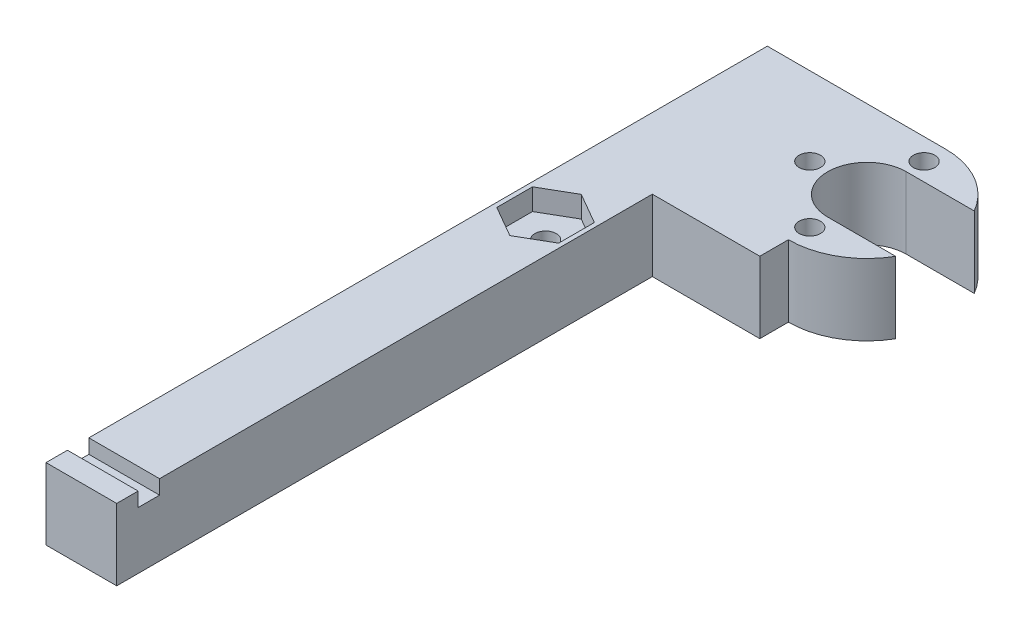
ISO-10303-21;
HEADER;
FILE_DESCRIPTION(('STEP AP214'),'2;1');
FILE_NAME('part.step','',(''),(''),'','','');
FILE_SCHEMA(('AUTOMOTIVE_DESIGN { 1 0 10303 214 1 1 1 1 }'));
ENDSEC;
DATA;
#1=APPLICATION_CONTEXT('core data for automotive mechanical design processes');
#2=APPLICATION_PROTOCOL_DEFINITION('international standard','automotive_design',2000,#1);
#3=PRODUCT_CONTEXT('',#1,'mechanical');
#4=PRODUCT('Part','Part','',(#3));
#5=PRODUCT_RELATED_PRODUCT_CATEGORY('part','',(#4));
#6=PRODUCT_DEFINITION_FORMATION('','',#4);
#7=PRODUCT_DEFINITION_CONTEXT('part definition',#1,'design');
#8=PRODUCT_DEFINITION('design','',#6,#7);
#9=PRODUCT_DEFINITION_SHAPE('','',#8);
#10=(LENGTH_UNIT() NAMED_UNIT(*) SI_UNIT(.MILLI.,.METRE.));
#11=(NAMED_UNIT(*) PLANE_ANGLE_UNIT() SI_UNIT($,.RADIAN.));
#12=(NAMED_UNIT(*) SI_UNIT($,.STERADIAN.) SOLID_ANGLE_UNIT());
#13=UNCERTAINTY_MEASURE_WITH_UNIT(LENGTH_MEASURE(1.E-05),#10,'distance_accuracy_value','');
#14=(GEOMETRIC_REPRESENTATION_CONTEXT(3) GLOBAL_UNCERTAINTY_ASSIGNED_CONTEXT((#13)) GLOBAL_UNIT_ASSIGNED_CONTEXT((#10,
#11,#12)) REPRESENTATION_CONTEXT('',''));
#15=CARTESIAN_POINT('',(0.,0.,0.));
#16=DIRECTION('',(0.,0.,1.));
#17=DIRECTION('',(1.,0.,0.));
#18=AXIS2_PLACEMENT_3D('',#15,#16,#17);
#19=CARTESIAN_POINT('',(4.95,0.,10.));
#20=DIRECTION('',(0.,1.,0.));
#21=DIRECTION('',(0.,0.,1.));
#22=AXIS2_PLACEMENT_3D('',#19,#20,#21);
#23=CYLINDRICAL_SURFACE('',#22,1.5);
#24=CARTESIAN_POINT('',(4.95,0.,10.));
#25=DIRECTION('',(0.,1.,0.));
#26=DIRECTION('',(0.,0.,1.));
#27=AXIS2_PLACEMENT_3D('',#24,#25,#26);
#28=CIRCLE('',#27,1.5);
#29=CARTESIAN_POINT('',(4.95,0.,11.5));
#30=VERTEX_POINT('',#29);
#31=EDGE_CURVE('E233',#30,#30,#28,.T.);
#32=ORIENTED_EDGE('',*,*,#31,.F.);
#33=EDGE_LOOP('',(#32));
#34=FACE_BOUND('',#33,.T.);
#35=CARTESIAN_POINT('',(4.95,7.,10.));
#36=DIRECTION('',(0.,1.,0.));
#37=DIRECTION('',(0.,0.,1.));
#38=AXIS2_PLACEMENT_3D('',#35,#36,#37);
#39=CIRCLE('',#38,1.5);
#40=CARTESIAN_POINT('',(4.95,7.,11.5));
#41=VERTEX_POINT('',#40);
#42=EDGE_CURVE('E38',#41,#41,#39,.F.);
#43=ORIENTED_EDGE('',*,*,#42,.F.);
#44=EDGE_LOOP('',(#43));
#45=FACE_BOUND('',#44,.T.);
#46=ADVANCED_FACE('F34',(#34,#45),#23,.F.);
#47=CARTESIAN_POINT('',(24.95,10.,-15.));
#48=DIRECTION('',(0.,-1.,0.));
#49=DIRECTION('',(0.,0.,-1.));
#50=AXIS2_PLACEMENT_3D('',#47,#48,#49);
#51=CYLINDRICAL_SURFACE('',#50,11.);
#52=CARTESIAN_POINT('',(24.95,10.,-15.));
#53=DIRECTION('',(0.,1.,0.));
#54=DIRECTION('',(0.,0.,1.));
#55=AXIS2_PLACEMENT_3D('',#52,#53,#54);
#56=CIRCLE('',#55,11.);
#57=CARTESIAN_POINT('',(34.4762794416288,10.,-20.5));
#58=VERTEX_POINT('',#57);
#59=CARTESIAN_POINT('',(24.95,10.,-26.));
#60=VERTEX_POINT('',#59);
#61=EDGE_CURVE('E318',#58,#60,#56,.T.);
#62=ORIENTED_EDGE('',*,*,#61,.F.);
#63=DIRECTION('',(0.,-1.,0.));
#64=VECTOR('',#63,1.);
#65=CARTESIAN_POINT('',(34.4762794416288,10.,-20.5));
#66=LINE('',#65,#64);
#67=CARTESIAN_POINT('',(34.4762794416288,0.,-20.5));
#68=VERTEX_POINT('',#67);
#69=EDGE_CURVE('E252',#58,#68,#66,.T.);
#70=ORIENTED_EDGE('',*,*,#69,.T.);
#71=CARTESIAN_POINT('',(24.95,0.,-15.));
#72=DIRECTION('',(0.,1.,0.));
#73=DIRECTION('',(0.,0.,1.));
#74=AXIS2_PLACEMENT_3D('',#71,#72,#73);
#75=CIRCLE('',#74,11.);
#76=CARTESIAN_POINT('',(24.95,0.,-26.));
#77=VERTEX_POINT('',#76);
#78=EDGE_CURVE('E334',#68,#77,#75,.T.);
#79=ORIENTED_EDGE('',*,*,#78,.T.);
#80=DIRECTION('',(0.,-1.,0.));
#81=VECTOR('',#80,1.);
#82=CARTESIAN_POINT('',(24.95,10.,-26.));
#83=LINE('',#82,#81);
#84=EDGE_CURVE('E343',#60,#77,#83,.T.);
#85=ORIENTED_EDGE('',*,*,#84,.F.);
#86=EDGE_LOOP('',(#62,#70,#79,#85));
#87=FACE_BOUND('',#86,.T.);
#88=ADVANCED_FACE('F416',(#87),#51,.T.);
#89=CARTESIAN_POINT('',(24.95,10.,-15.));
#90=DIRECTION('',(0.,1.,0.));
#91=DIRECTION('',(0.,0.,1.));
#92=AXIS2_PLACEMENT_3D('',#89,#90,#91);
#93=PLANE('',#92);
#94=DIRECTION('',(-0.866025403784439,0.,-0.5));
#95=VECTOR('',#94,1.);
#96=CARTESIAN_POINT('',(9.2801270189222,10.,7.5));
#97=LINE('',#96,#95);
#98=CARTESIAN_POINT('',(9.2801270189222,10.,7.5));
#99=VERTEX_POINT('',#98);
#100=CARTESIAN_POINT('',(4.95000000000001,10.,5.));
#101=VERTEX_POINT('',#100);
#102=EDGE_CURVE('E50',#99,#101,#97,.T.);
#103=ORIENTED_EDGE('',*,*,#102,.F.);
#104=DIRECTION('',(0.,0.,-1.));
#105=VECTOR('',#104,1.);
#106=CARTESIAN_POINT('',(9.2801270189222,10.,12.5));
#107=LINE('',#106,#105);
#108=CARTESIAN_POINT('',(9.2801270189222,10.,12.5));
#109=VERTEX_POINT('',#108);
#110=EDGE_CURVE('E200',#109,#99,#107,.T.);
#111=ORIENTED_EDGE('',*,*,#110,.F.);
#112=DIRECTION('',(0.866025403784439,0.,-0.5));
#113=VECTOR('',#112,1.);
#114=CARTESIAN_POINT('',(4.95000000000001,10.,15.));
#115=LINE('',#114,#113);
#116=CARTESIAN_POINT('',(4.95000000000001,10.,15.));
#117=VERTEX_POINT('',#116);
#118=EDGE_CURVE('E203',#117,#109,#115,.T.);
#119=ORIENTED_EDGE('',*,*,#118,.F.);
#120=DIRECTION('',(0.866025403784439,0.,0.5));
#121=VECTOR('',#120,1.);
#122=CARTESIAN_POINT('',(0.619872981077811,10.,12.5));
#123=LINE('',#122,#121);
#124=CARTESIAN_POINT('',(0.619872981077811,10.,12.5));
#125=VERTEX_POINT('',#124);
#126=EDGE_CURVE('E219',#125,#117,#123,.T.);
#127=ORIENTED_EDGE('',*,*,#126,.F.);
#128=DIRECTION('',(0.,0.,1.));
#129=VECTOR('',#128,1.);
#130=CARTESIAN_POINT('',(0.61987298107781,10.,7.5));
#131=LINE('',#130,#129);
#132=CARTESIAN_POINT('',(0.61987298107781,10.,7.5));
#133=VERTEX_POINT('',#132);
#134=EDGE_CURVE('E216',#133,#125,#131,.T.);
#135=ORIENTED_EDGE('',*,*,#134,.F.);
#136=DIRECTION('',(-0.866025403784439,0.,0.5));
#137=VECTOR('',#136,1.);
#138=CARTESIAN_POINT('',(4.95,10.,5.));
#139=LINE('',#138,#137);
#140=EDGE_CURVE('E214',#101,#133,#139,.T.);
#141=ORIENTED_EDGE('',*,*,#140,.F.);
#142=EDGE_LOOP('',(#103,#111,#119,#127,#135,#141));
#143=FACE_BOUND('',#142,.T.);
#144=DIRECTION('',(-1.,0.,0.));
#145=VECTOR('',#144,1.);
#146=CARTESIAN_POINT('',(24.95,10.,-20.5));
#147=LINE('',#146,#145);
#148=CARTESIAN_POINT('',(24.95,10.,-20.5));
#149=VERTEX_POINT('',#148);
#150=EDGE_CURVE('E239',#58,#149,#147,.T.);
#151=ORIENTED_EDGE('',*,*,#150,.F.);
#152=ORIENTED_EDGE('',*,*,#61,.T.);
#153=DIRECTION('',(-1.,0.,0.));
#154=VECTOR('',#153,1.);
#155=CARTESIAN_POINT('',(0.,10.,-26.));
#156=LINE('',#155,#154);
#157=CARTESIAN_POINT('',(0.,10.,-26.));
#158=VERTEX_POINT('',#157);
#159=EDGE_CURVE('E322',#60,#158,#156,.T.);
#160=ORIENTED_EDGE('',*,*,#159,.T.);
#161=DIRECTION('',(0.,0.,1.));
#162=VECTOR('',#161,1.);
#163=CARTESIAN_POINT('',(0.,10.,0.));
#164=LINE('',#163,#162);
#165=CARTESIAN_POINT('',(0.,10.,69.));
#166=VERTEX_POINT('',#165);
#167=EDGE_CURVE('E304',#158,#166,#164,.T.);
#168=ORIENTED_EDGE('',*,*,#167,.T.);
#169=DIRECTION('',(-1.,0.,0.));
#170=VECTOR('',#169,1.);
#171=CARTESIAN_POINT('',(0.,10.,69.));
#172=LINE('',#171,#170);
#173=CARTESIAN_POINT('',(9.90000000000001,10.,69.));
#174=VERTEX_POINT('',#173);
#175=EDGE_CURVE('E260',#174,#166,#172,.T.);
#176=ORIENTED_EDGE('',*,*,#175,.F.);
#177=DIRECTION('',(0.,0.,-1.));
#178=VECTOR('',#177,1.);
#179=CARTESIAN_POINT('',(9.90000000000001,10.,75.));
#180=LINE('',#179,#178);
#181=CARTESIAN_POINT('',(9.90000000000001,10.,0.));
#182=VERTEX_POINT('',#181);
#183=EDGE_CURVE('E310',#174,#182,#180,.T.);
#184=ORIENTED_EDGE('',*,*,#183,.T.);
#185=DIRECTION('',(1.,0.,0.));
#186=VECTOR('',#185,1.);
#187=CARTESIAN_POINT('',(9.90000000000001,10.,0.));
#188=LINE('',#187,#186);
#189=CARTESIAN_POINT('',(24.95,10.,0.));
#190=VERTEX_POINT('',#189);
#191=EDGE_CURVE('E314',#182,#190,#188,.T.);
#192=ORIENTED_EDGE('',*,*,#191,.T.);
#193=DIRECTION('',(0.,0.,-1.));
#194=VECTOR('',#193,1.);
#195=CARTESIAN_POINT('',(24.95,10.,0.));
#196=LINE('',#195,#194);
#197=CARTESIAN_POINT('',(24.95,10.,-4.));
#198=VERTEX_POINT('',#197);
#199=EDGE_CURVE('E316',#190,#198,#196,.T.);
#200=ORIENTED_EDGE('',*,*,#199,.T.);
#201=CARTESIAN_POINT('',(34.4762794416288,10.,-9.5));
#202=VERTEX_POINT('',#201);
#203=EDGE_CURVE('E319',#198,#202,#56,.T.);
#204=ORIENTED_EDGE('',*,*,#203,.T.);
#205=DIRECTION('',(1.,0.,0.));
#206=VECTOR('',#205,1.);
#207=CARTESIAN_POINT('',(24.95,10.,-9.5));
#208=LINE('',#207,#206);
#209=CARTESIAN_POINT('',(24.95,10.,-9.5));
#210=VERTEX_POINT('',#209);
#211=EDGE_CURVE('E236',#210,#202,#208,.T.);
#212=ORIENTED_EDGE('',*,*,#211,.F.);
#213=CARTESIAN_POINT('',(24.95,10.,-15.));
#214=DIRECTION('',(0.,1.,0.));
#215=DIRECTION('',(0.,0.,1.));
#216=AXIS2_PLACEMENT_3D('',#213,#214,#215);
#217=CIRCLE('',#216,5.5);
#218=EDGE_CURVE('E298',#149,#210,#217,.T.);
#219=ORIENTED_EDGE('',*,*,#218,.F.);
#220=EDGE_LOOP('',(#151,#152,#160,#168,#176,#184,#192,#200,#204,#212,#219));
#221=FACE_BOUND('',#220,.T.);
#222=CARTESIAN_POINT('',(24.95,10.,-7.));
#223=DIRECTION('',(0.,1.,0.));
#224=DIRECTION('',(0.,0.,1.));
#225=AXIS2_PLACEMENT_3D('',#222,#223,#224);
#226=CIRCLE('',#225,1.5);
#227=CARTESIAN_POINT('',(24.95,10.,-5.5));
#228=VERTEX_POINT('',#227);
#229=EDGE_CURVE('E286',#228,#228,#226,.T.);
#230=ORIENTED_EDGE('',*,*,#229,.F.);
#231=EDGE_LOOP('',(#230));
#232=FACE_BOUND('',#231,.T.);
#233=CARTESIAN_POINT('',(24.95,10.,-23.));
#234=DIRECTION('',(0.,1.,0.));
#235=DIRECTION('',(0.,0.,1.));
#236=AXIS2_PLACEMENT_3D('',#233,#234,#235);
#237=CIRCLE('',#236,1.5);
#238=CARTESIAN_POINT('',(24.95,10.,-21.5));
#239=VERTEX_POINT('',#238);
#240=EDGE_CURVE('E292',#239,#239,#237,.T.);
#241=ORIENTED_EDGE('',*,*,#240,.F.);
#242=EDGE_LOOP('',(#241));
#243=FACE_BOUND('',#242,.T.);
#244=CARTESIAN_POINT('',(16.95,10.,-15.));
#245=DIRECTION('',(0.,1.,0.));
#246=DIRECTION('',(0.,0.,1.));
#247=AXIS2_PLACEMENT_3D('',#244,#245,#246);
#248=CIRCLE('',#247,1.5);
#249=CARTESIAN_POINT('',(16.95,10.,-13.5));
#250=VERTEX_POINT('',#249);
#251=EDGE_CURVE('E280',#250,#250,#248,.T.);
#252=ORIENTED_EDGE('',*,*,#251,.F.);
#253=EDGE_LOOP('',(#252));
#254=FACE_BOUND('',#253,.T.);
#255=ADVANCED_FACE('F384',(#143,#221,#232,#243,#254),#93,.T.);
#256=DIRECTION('',(1.,0.,0.));
#257=VECTOR('',#256,1.);
#258=CARTESIAN_POINT('',(0.,10.,72.));
#259=LINE('',#258,#257);
#260=CARTESIAN_POINT('',(0.,10.,72.));
#261=VERTEX_POINT('',#260);
#262=CARTESIAN_POINT('',(9.90000000000001,10.,72.));
#263=VERTEX_POINT('',#262);
#264=EDGE_CURVE('E255',#261,#263,#259,.T.);
#265=ORIENTED_EDGE('',*,*,#264,.F.);
#266=CARTESIAN_POINT('',(0.,10.,75.));
#267=VERTEX_POINT('',#266);
#268=EDGE_CURVE('E308',#261,#267,#164,.T.);
#269=ORIENTED_EDGE('',*,*,#268,.T.);
#270=DIRECTION('',(1.,0.,0.));
#271=VECTOR('',#270,1.);
#272=CARTESIAN_POINT('',(0.,10.,75.));
#273=LINE('',#272,#271);
#274=CARTESIAN_POINT('',(9.90000000000001,10.,75.));
#275=VERTEX_POINT('',#274);
#276=EDGE_CURVE('E307',#267,#275,#273,.T.);
#277=ORIENTED_EDGE('',*,*,#276,.T.);
#278=EDGE_CURVE('E311',#275,#263,#180,.T.);
#279=ORIENTED_EDGE('',*,*,#278,.T.);
#280=EDGE_LOOP('',(#265,#269,#277,#279));
#281=FACE_BOUND('',#280,.T.);
#282=ADVANCED_FACE('F406',(#281),#93,.T.);
#283=CARTESIAN_POINT('',(24.95,0.,-15.));
#284=DIRECTION('',(0.,1.,0.));
#285=DIRECTION('',(0.,0.,1.));
#286=AXIS2_PLACEMENT_3D('',#283,#284,#285);
#287=PLANE('',#286);
#288=ORIENTED_EDGE('',*,*,#31,.T.);
#289=EDGE_LOOP('',(#288));
#290=FACE_BOUND('',#289,.T.);
#291=ORIENTED_EDGE('',*,*,#78,.F.);
#292=DIRECTION('',(-1.,0.,0.));
#293=VECTOR('',#292,1.);
#294=CARTESIAN_POINT('',(24.95,0.,-20.5));
#295=LINE('',#294,#293);
#296=CARTESIAN_POINT('',(24.95,0.,-20.5));
#297=VERTEX_POINT('',#296);
#298=EDGE_CURVE('E238',#68,#297,#295,.T.);
#299=ORIENTED_EDGE('',*,*,#298,.T.);
#300=CARTESIAN_POINT('',(24.95,0.,-15.));
#301=DIRECTION('',(0.,1.,0.));
#302=DIRECTION('',(0.,0.,1.));
#303=AXIS2_PLACEMENT_3D('',#300,#301,#302);
#304=CIRCLE('',#303,5.5);
#305=CARTESIAN_POINT('',(24.95,0.,-9.5));
#306=VERTEX_POINT('',#305);
#307=EDGE_CURVE('E295',#297,#306,#304,.T.);
#308=ORIENTED_EDGE('',*,*,#307,.T.);
#309=DIRECTION('',(1.,0.,0.));
#310=VECTOR('',#309,1.);
#311=CARTESIAN_POINT('',(24.95,0.,-9.5));
#312=LINE('',#311,#310);
#313=CARTESIAN_POINT('',(34.4762794416288,0.,-9.5));
#314=VERTEX_POINT('',#313);
#315=EDGE_CURVE('E58',#306,#314,#312,.T.);
#316=ORIENTED_EDGE('',*,*,#315,.T.);
#317=CARTESIAN_POINT('',(24.95,0.,-4.));
#318=VERTEX_POINT('',#317);
#319=EDGE_CURVE('E335',#318,#314,#75,.T.);
#320=ORIENTED_EDGE('',*,*,#319,.F.);
#321=DIRECTION('',(0.,0.,-1.));
#322=VECTOR('',#321,1.);
#323=CARTESIAN_POINT('',(24.95,0.,0.));
#324=LINE('',#323,#322);
#325=CARTESIAN_POINT('',(24.95,0.,0.));
#326=VERTEX_POINT('',#325);
#327=EDGE_CURVE('E332',#326,#318,#324,.T.);
#328=ORIENTED_EDGE('',*,*,#327,.F.);
#329=DIRECTION('',(1.,0.,0.));
#330=VECTOR('',#329,1.);
#331=CARTESIAN_POINT('',(9.90000000000001,0.,0.));
#332=LINE('',#331,#330);
#333=CARTESIAN_POINT('',(9.90000000000001,0.,0.));
#334=VERTEX_POINT('',#333);
#335=EDGE_CURVE('E330',#334,#326,#332,.T.);
#336=ORIENTED_EDGE('',*,*,#335,.F.);
#337=DIRECTION('',(0.,0.,-1.));
#338=VECTOR('',#337,1.);
#339=CARTESIAN_POINT('',(9.90000000000001,0.,75.));
#340=LINE('',#339,#338);
#341=CARTESIAN_POINT('',(9.90000000000001,0.,75.));
#342=VERTEX_POINT('',#341);
#343=EDGE_CURVE('E328',#342,#334,#340,.T.);
#344=ORIENTED_EDGE('',*,*,#343,.F.);
#345=DIRECTION('',(1.,0.,0.));
#346=VECTOR('',#345,1.);
#347=CARTESIAN_POINT('',(0.,0.,75.));
#348=LINE('',#347,#346);
#349=CARTESIAN_POINT('',(0.,0.,75.));
#350=VERTEX_POINT('',#349);
#351=EDGE_CURVE('E326',#350,#342,#348,.T.);
#352=ORIENTED_EDGE('',*,*,#351,.F.);
#353=DIRECTION('',(0.,0.,1.));
#354=VECTOR('',#353,1.);
#355=CARTESIAN_POINT('',(0.,0.,0.));
#356=LINE('',#355,#354);
#357=CARTESIAN_POINT('',(0.,0.,-26.));
#358=VERTEX_POINT('',#357);
#359=EDGE_CURVE('E301',#358,#350,#356,.T.);
#360=ORIENTED_EDGE('',*,*,#359,.F.);
#361=DIRECTION('',(-1.,0.,0.));
#362=VECTOR('',#361,1.);
#363=CARTESIAN_POINT('',(0.,0.,-26.));
#364=LINE('',#363,#362);
#365=EDGE_CURVE('E338',#77,#358,#364,.T.);
#366=ORIENTED_EDGE('',*,*,#365,.F.);
#367=EDGE_LOOP('',(#291,#299,#308,#316,#320,#328,#336,#344,#352,#360,#366));
#368=FACE_BOUND('',#367,.T.);
#369=CARTESIAN_POINT('',(24.95,0.,-23.));
#370=DIRECTION('',(0.,1.,0.));
#371=DIRECTION('',(0.,0.,1.));
#372=AXIS2_PLACEMENT_3D('',#369,#370,#371);
#373=CIRCLE('',#372,1.5);
#374=CARTESIAN_POINT('',(24.95,0.,-21.5));
#375=VERTEX_POINT('',#374);
#376=EDGE_CURVE('E289',#375,#375,#373,.T.);
#377=ORIENTED_EDGE('',*,*,#376,.T.);
#378=EDGE_LOOP('',(#377));
#379=FACE_BOUND('',#378,.T.);
#380=CARTESIAN_POINT('',(24.95,0.,-7.));
#381=DIRECTION('',(0.,1.,0.));
#382=DIRECTION('',(0.,0.,1.));
#383=AXIS2_PLACEMENT_3D('',#380,#381,#382);
#384=CIRCLE('',#383,1.5);
#385=CARTESIAN_POINT('',(24.95,0.,-5.5));
#386=VERTEX_POINT('',#385);
#387=EDGE_CURVE('E283',#386,#386,#384,.T.);
#388=ORIENTED_EDGE('',*,*,#387,.T.);
#389=EDGE_LOOP('',(#388));
#390=FACE_BOUND('',#389,.T.);
#391=CARTESIAN_POINT('',(16.95,0.,-15.));
#392=DIRECTION('',(0.,1.,0.));
#393=DIRECTION('',(0.,0.,1.));
#394=AXIS2_PLACEMENT_3D('',#391,#392,#393);
#395=CIRCLE('',#394,1.5);
#396=CARTESIAN_POINT('',(16.95,0.,-13.5));
#397=VERTEX_POINT('',#396);
#398=EDGE_CURVE('E273',#397,#397,#395,.T.);
#399=ORIENTED_EDGE('',*,*,#398,.T.);
#400=EDGE_LOOP('',(#399));
#401=FACE_BOUND('',#400,.T.);
#402=ADVANCED_FACE('F369',(#290,#368,#379,#390,#401),#287,.F.);
#403=CARTESIAN_POINT('',(0.,10.,0.));
#404=DIRECTION('',(1.,0.,0.));
#405=DIRECTION('',(0.,0.,-1.));
#406=AXIS2_PLACEMENT_3D('',#403,#404,#405);
#407=PLANE('',#406);
#408=DIRECTION('',(0.,0.,1.));
#409=VECTOR('',#408,1.);
#410=CARTESIAN_POINT('',(0.,8.,69.));
#411=LINE('',#410,#409);
#412=CARTESIAN_POINT('',(0.,8.,69.));
#413=VERTEX_POINT('',#412);
#414=CARTESIAN_POINT('',(0.,8.,72.));
#415=VERTEX_POINT('',#414);
#416=EDGE_CURVE('E256',#413,#415,#411,.T.);
#417=ORIENTED_EDGE('',*,*,#416,.F.);
#418=DIRECTION('',(0.,1.,0.));
#419=VECTOR('',#418,1.);
#420=CARTESIAN_POINT('',(0.,8.,69.));
#421=LINE('',#420,#419);
#422=EDGE_CURVE('E270',#413,#166,#421,.T.);
#423=ORIENTED_EDGE('',*,*,#422,.T.);
#424=ORIENTED_EDGE('',*,*,#167,.F.);
#425=DIRECTION('',(0.,-1.,0.));
#426=VECTOR('',#425,1.);
#427=CARTESIAN_POINT('',(0.,10.,-26.));
#428=LINE('',#427,#426);
#429=EDGE_CURVE('E324',#158,#358,#428,.T.);
#430=ORIENTED_EDGE('',*,*,#429,.T.);
#431=ORIENTED_EDGE('',*,*,#359,.T.);
#432=DIRECTION('',(0.,-1.,0.));
#433=VECTOR('',#432,1.);
#434=CARTESIAN_POINT('',(0.,10.,75.));
#435=LINE('',#434,#433);
#436=EDGE_CURVE('E11',#267,#350,#435,.T.);
#437=ORIENTED_EDGE('',*,*,#436,.F.);
#438=ORIENTED_EDGE('',*,*,#268,.F.);
#439=DIRECTION('',(0.,1.,0.));
#440=VECTOR('',#439,1.);
#441=CARTESIAN_POINT('',(0.,8.,72.));
#442=LINE('',#441,#440);
#443=EDGE_CURVE('E267',#415,#261,#442,.T.);
#444=ORIENTED_EDGE('',*,*,#443,.F.);
#445=EDGE_LOOP('',(#417,#423,#424,#430,#431,#437,#438,#444));
#446=FACE_BOUND('',#445,.T.);
#447=ADVANCED_FACE('F36',(#446),#407,.F.);
#448=CARTESIAN_POINT('',(0.,10.,75.));
#449=DIRECTION('',(0.,0.,-1.));
#450=DIRECTION('',(-1.,0.,0.));
#451=AXIS2_PLACEMENT_3D('',#448,#449,#450);
#452=PLANE('',#451);
#453=ORIENTED_EDGE('',*,*,#351,.T.);
#454=DIRECTION('',(0.,-1.,0.));
#455=VECTOR('',#454,1.);
#456=CARTESIAN_POINT('',(9.90000000000001,10.,75.));
#457=LINE('',#456,#455);
#458=EDGE_CURVE('E43',#275,#342,#457,.T.);
#459=ORIENTED_EDGE('',*,*,#458,.F.);
#460=ORIENTED_EDGE('',*,*,#276,.F.);
#461=ORIENTED_EDGE('',*,*,#436,.T.);
#462=EDGE_LOOP('',(#453,#459,#460,#461));
#463=FACE_BOUND('',#462,.T.);
#464=ADVANCED_FACE('F407',(#463),#452,.F.);
#465=CARTESIAN_POINT('',(9.90000000000001,10.,75.));
#466=DIRECTION('',(-1.,0.,0.));
#467=DIRECTION('',(0.,0.,1.));
#468=AXIS2_PLACEMENT_3D('',#465,#466,#467);
#469=PLANE('',#468);
#470=ORIENTED_EDGE('',*,*,#183,.F.);
#471=DIRECTION('',(0.,1.,0.));
#472=VECTOR('',#471,1.);
#473=CARTESIAN_POINT('',(9.90000000000001,8.,69.));
#474=LINE('',#473,#472);
#475=CARTESIAN_POINT('',(9.90000000000001,8.,69.));
#476=VERTEX_POINT('',#475);
#477=EDGE_CURVE('E274',#476,#174,#474,.T.);
#478=ORIENTED_EDGE('',*,*,#477,.F.);
#479=DIRECTION('',(0.,0.,-1.));
#480=VECTOR('',#479,1.);
#481=CARTESIAN_POINT('',(9.90000000000001,8.,69.));
#482=LINE('',#481,#480);
#483=CARTESIAN_POINT('',(9.90000000000001,8.,72.));
#484=VERTEX_POINT('',#483);
#485=EDGE_CURVE('E262',#484,#476,#482,.T.);
#486=ORIENTED_EDGE('',*,*,#485,.F.);
#487=DIRECTION('',(0.,1.,0.));
#488=VECTOR('',#487,1.);
#489=CARTESIAN_POINT('',(9.90000000000001,8.,72.));
#490=LINE('',#489,#488);
#491=EDGE_CURVE('E276',#484,#263,#490,.T.);
#492=ORIENTED_EDGE('',*,*,#491,.T.);
#493=ORIENTED_EDGE('',*,*,#278,.F.);
#494=ORIENTED_EDGE('',*,*,#458,.T.);
#495=ORIENTED_EDGE('',*,*,#343,.T.);
#496=DIRECTION('',(0.,-1.,0.));
#497=VECTOR('',#496,1.);
#498=CARTESIAN_POINT('',(9.90000000000001,10.,0.));
#499=LINE('',#498,#497);
#500=EDGE_CURVE('E352',#182,#334,#499,.T.);
#501=ORIENTED_EDGE('',*,*,#500,.F.);
#502=EDGE_LOOP('',(#470,#478,#486,#492,#493,#494,#495,#501));
#503=FACE_BOUND('',#502,.T.);
#504=ADVANCED_FACE('F361',(#503),#469,.F.);
#505=CARTESIAN_POINT('',(9.90000000000001,10.,0.));
#506=DIRECTION('',(0.,0.,-1.));
#507=DIRECTION('',(-1.,0.,0.));
#508=AXIS2_PLACEMENT_3D('',#505,#506,#507);
#509=PLANE('',#508);
#510=ORIENTED_EDGE('',*,*,#335,.T.);
#511=DIRECTION('',(0.,-1.,0.));
#512=VECTOR('',#511,1.);
#513=CARTESIAN_POINT('',(24.95,10.,0.));
#514=LINE('',#513,#512);
#515=EDGE_CURVE('E349',#190,#326,#514,.T.);
#516=ORIENTED_EDGE('',*,*,#515,.F.);
#517=ORIENTED_EDGE('',*,*,#191,.F.);
#518=ORIENTED_EDGE('',*,*,#500,.T.);
#519=EDGE_LOOP('',(#510,#516,#517,#518));
#520=FACE_BOUND('',#519,.T.);
#521=ADVANCED_FACE('F375',(#520),#509,.F.);
#522=CARTESIAN_POINT('',(24.95,10.,0.));
#523=DIRECTION('',(-1.,0.,0.));
#524=DIRECTION('',(0.,0.,1.));
#525=AXIS2_PLACEMENT_3D('',#522,#523,#524);
#526=PLANE('',#525);
#527=ORIENTED_EDGE('',*,*,#327,.T.);
#528=DIRECTION('',(0.,-1.,0.));
#529=VECTOR('',#528,1.);
#530=CARTESIAN_POINT('',(24.95,10.,-4.));
#531=LINE('',#530,#529);
#532=EDGE_CURVE('E346',#198,#318,#531,.T.);
#533=ORIENTED_EDGE('',*,*,#532,.F.);
#534=ORIENTED_EDGE('',*,*,#199,.F.);
#535=ORIENTED_EDGE('',*,*,#515,.T.);
#536=EDGE_LOOP('',(#527,#533,#534,#535));
#537=FACE_BOUND('',#536,.T.);
#538=ADVANCED_FACE('F379',(#537),#526,.F.);
#539=ORIENTED_EDGE('',*,*,#319,.T.);
#540=DIRECTION('',(0.,-1.,0.));
#541=VECTOR('',#540,1.);
#542=CARTESIAN_POINT('',(34.4762794416288,10.,-9.5));
#543=LINE('',#542,#541);
#544=EDGE_CURVE('E248',#314,#202,#543,.F.);
#545=ORIENTED_EDGE('',*,*,#544,.T.);
#546=ORIENTED_EDGE('',*,*,#203,.F.);
#547=ORIENTED_EDGE('',*,*,#532,.T.);
#548=EDGE_LOOP('',(#539,#545,#546,#547));
#549=FACE_BOUND('',#548,.T.);
#550=ADVANCED_FACE('F439',(#549),#51,.T.);
#551=CARTESIAN_POINT('',(0.,10.,-26.));
#552=DIRECTION('',(0.,0.,1.));
#553=DIRECTION('',(1.,0.,0.));
#554=AXIS2_PLACEMENT_3D('',#551,#552,#553);
#555=PLANE('',#554);
#556=ORIENTED_EDGE('',*,*,#365,.T.);
#557=ORIENTED_EDGE('',*,*,#429,.F.);
#558=ORIENTED_EDGE('',*,*,#159,.F.);
#559=ORIENTED_EDGE('',*,*,#84,.T.);
#560=EDGE_LOOP('',(#556,#557,#558,#559));
#561=FACE_BOUND('',#560,.T.);
#562=ADVANCED_FACE('F411',(#561),#555,.F.);
#563=CARTESIAN_POINT('',(24.95,10.,-15.));
#564=DIRECTION('',(0.,-1.,0.));
#565=DIRECTION('',(0.,0.,-1.));
#566=AXIS2_PLACEMENT_3D('',#563,#564,#565);
#567=CYLINDRICAL_SURFACE('',#566,5.5);
#568=DIRECTION('',(0.,1.,0.));
#569=VECTOR('',#568,1.);
#570=CARTESIAN_POINT('',(24.95,0.,-20.5));
#571=LINE('',#570,#569);
#572=EDGE_CURVE('E245',#297,#149,#571,.T.);
#573=ORIENTED_EDGE('',*,*,#572,.T.);
#574=ORIENTED_EDGE('',*,*,#218,.T.);
#575=DIRECTION('',(0.,1.,0.));
#576=VECTOR('',#575,1.);
#577=CARTESIAN_POINT('',(24.95,0.,-9.5));
#578=LINE('',#577,#576);
#579=EDGE_CURVE('E242',#306,#210,#578,.T.);
#580=ORIENTED_EDGE('',*,*,#579,.F.);
#581=ORIENTED_EDGE('',*,*,#307,.F.);
#582=EDGE_LOOP('',(#573,#574,#580,#581));
#583=FACE_BOUND('',#582,.T.);
#584=ADVANCED_FACE('F420',(#583),#567,.F.);
#585=CARTESIAN_POINT('',(24.95,10.,-23.));
#586=DIRECTION('',(0.,-1.,0.));
#587=DIRECTION('',(0.,0.,-1.));
#588=AXIS2_PLACEMENT_3D('',#585,#586,#587);
#589=CYLINDRICAL_SURFACE('',#588,1.5);
#590=ORIENTED_EDGE('',*,*,#240,.T.);
#591=EDGE_LOOP('',(#590));
#592=FACE_BOUND('',#591,.T.);
#593=ORIENTED_EDGE('',*,*,#376,.F.);
#594=EDGE_LOOP('',(#593));
#595=FACE_BOUND('',#594,.T.);
#596=ADVANCED_FACE('F528',(#592,#595),#589,.F.);
#597=CARTESIAN_POINT('',(24.95,10.,-7.));
#598=DIRECTION('',(0.,-1.,0.));
#599=DIRECTION('',(0.,0.,-1.));
#600=AXIS2_PLACEMENT_3D('',#597,#598,#599);
#601=CYLINDRICAL_SURFACE('',#600,1.5);
#602=ORIENTED_EDGE('',*,*,#229,.T.);
#603=EDGE_LOOP('',(#602));
#604=FACE_BOUND('',#603,.T.);
#605=ORIENTED_EDGE('',*,*,#387,.F.);
#606=EDGE_LOOP('',(#605));
#607=FACE_BOUND('',#606,.T.);
#608=ADVANCED_FACE('F516',(#604,#607),#601,.F.);
#609=CARTESIAN_POINT('',(16.95,10.,-15.));
#610=DIRECTION('',(0.,-1.,0.));
#611=DIRECTION('',(0.,0.,-1.));
#612=AXIS2_PLACEMENT_3D('',#609,#610,#611);
#613=CYLINDRICAL_SURFACE('',#612,1.5);
#614=ORIENTED_EDGE('',*,*,#251,.T.);
#615=EDGE_LOOP('',(#614));
#616=FACE_BOUND('',#615,.T.);
#617=ORIENTED_EDGE('',*,*,#398,.F.);
#618=EDGE_LOOP('',(#617));
#619=FACE_BOUND('',#618,.T.);
#620=ADVANCED_FACE('F511',(#616,#619),#613,.F.);
#621=CARTESIAN_POINT('',(0.,8.,69.));
#622=DIRECTION('',(0.,0.,-1.));
#623=DIRECTION('',(-1.,0.,0.));
#624=AXIS2_PLACEMENT_3D('',#621,#622,#623);
#625=PLANE('',#624);
#626=ORIENTED_EDGE('',*,*,#175,.T.);
#627=ORIENTED_EDGE('',*,*,#422,.F.);
#628=DIRECTION('',(-1.,0.,0.));
#629=VECTOR('',#628,1.);
#630=CARTESIAN_POINT('',(0.,8.,69.));
#631=LINE('',#630,#629);
#632=EDGE_CURVE('E264',#476,#413,#631,.T.);
#633=ORIENTED_EDGE('',*,*,#632,.F.);
#634=ORIENTED_EDGE('',*,*,#477,.T.);
#635=EDGE_LOOP('',(#626,#627,#633,#634));
#636=FACE_BOUND('',#635,.T.);
#637=ADVANCED_FACE('F392',(#636),#625,.F.);
#638=CARTESIAN_POINT('',(0.,8.,72.));
#639=DIRECTION('',(0.,0.,1.));
#640=DIRECTION('',(1.,0.,0.));
#641=AXIS2_PLACEMENT_3D('',#638,#639,#640);
#642=PLANE('',#641);
#643=ORIENTED_EDGE('',*,*,#264,.T.);
#644=ORIENTED_EDGE('',*,*,#491,.F.);
#645=DIRECTION('',(1.,0.,0.));
#646=VECTOR('',#645,1.);
#647=CARTESIAN_POINT('',(0.,8.,72.));
#648=LINE('',#647,#646);
#649=EDGE_CURVE('E259',#415,#484,#648,.T.);
#650=ORIENTED_EDGE('',*,*,#649,.F.);
#651=ORIENTED_EDGE('',*,*,#443,.T.);
#652=EDGE_LOOP('',(#643,#644,#650,#651));
#653=FACE_BOUND('',#652,.T.);
#654=ADVANCED_FACE('F403',(#653),#642,.F.);
#655=CARTESIAN_POINT('',(0.,8.,0.));
#656=DIRECTION('',(0.,1.,0.));
#657=DIRECTION('',(0.,0.,1.));
#658=AXIS2_PLACEMENT_3D('',#655,#656,#657);
#659=PLANE('',#658);
#660=ORIENTED_EDGE('',*,*,#416,.T.);
#661=ORIENTED_EDGE('',*,*,#649,.T.);
#662=ORIENTED_EDGE('',*,*,#485,.T.);
#663=ORIENTED_EDGE('',*,*,#632,.T.);
#664=EDGE_LOOP('',(#660,#661,#662,#663));
#665=FACE_BOUND('',#664,.T.);
#666=ADVANCED_FACE('F395',(#665),#659,.T.);
#667=CARTESIAN_POINT('',(24.95,0.,-9.5));
#668=DIRECTION('',(0.,0.,1.));
#669=DIRECTION('',(1.,0.,0.));
#670=AXIS2_PLACEMENT_3D('',#667,#668,#669);
#671=PLANE('',#670);
#672=ORIENTED_EDGE('',*,*,#315,.F.);
#673=ORIENTED_EDGE('',*,*,#579,.T.);
#674=ORIENTED_EDGE('',*,*,#211,.T.);
#675=ORIENTED_EDGE('',*,*,#544,.F.);
#676=EDGE_LOOP('',(#672,#673,#674,#675));
#677=FACE_BOUND('',#676,.T.);
#678=ADVANCED_FACE('F422',(#677),#671,.F.);
#679=CARTESIAN_POINT('',(24.95,0.,-20.5));
#680=DIRECTION('',(0.,0.,-1.));
#681=DIRECTION('',(-1.,0.,0.));
#682=AXIS2_PLACEMENT_3D('',#679,#680,#681);
#683=PLANE('',#682);
#684=ORIENTED_EDGE('',*,*,#150,.T.);
#685=ORIENTED_EDGE('',*,*,#572,.F.);
#686=ORIENTED_EDGE('',*,*,#298,.F.);
#687=ORIENTED_EDGE('',*,*,#69,.F.);
#688=EDGE_LOOP('',(#684,#685,#686,#687));
#689=FACE_BOUND('',#688,.T.);
#690=ADVANCED_FACE('F423',(#689),#683,.F.);
#691=CARTESIAN_POINT('',(0.,7.,0.));
#692=DIRECTION('',(0.,1.,0.));
#693=DIRECTION('',(0.,0.,1.));
#694=AXIS2_PLACEMENT_3D('',#691,#692,#693);
#695=PLANE('',#694);
#696=DIRECTION('',(-0.866025403784439,0.,-0.5));
#697=VECTOR('',#696,1.);
#698=CARTESIAN_POINT('',(9.2801270189222,7.,7.5));
#699=LINE('',#698,#697);
#700=CARTESIAN_POINT('',(9.2801270189222,7.,7.5));
#701=VERTEX_POINT('',#700);
#702=CARTESIAN_POINT('',(4.95,7.,5.));
#703=VERTEX_POINT('',#702);
#704=EDGE_CURVE('E180',#701,#703,#699,.T.);
#705=ORIENTED_EDGE('',*,*,#704,.T.);
#706=DIRECTION('',(-0.866025403784439,0.,0.5));
#707=VECTOR('',#706,1.);
#708=CARTESIAN_POINT('',(4.95,7.,5.));
#709=LINE('',#708,#707);
#710=CARTESIAN_POINT('',(0.61987298107781,7.,7.5));
#711=VERTEX_POINT('',#710);
#712=EDGE_CURVE('E189',#703,#711,#709,.T.);
#713=ORIENTED_EDGE('',*,*,#712,.T.);
#714=DIRECTION('',(0.,0.,1.));
#715=VECTOR('',#714,1.);
#716=CARTESIAN_POINT('',(0.61987298107781,7.,7.5));
#717=LINE('',#716,#715);
#718=CARTESIAN_POINT('',(0.619872981077811,7.,12.5));
#719=VERTEX_POINT('',#718);
#720=EDGE_CURVE('E194',#711,#719,#717,.T.);
#721=ORIENTED_EDGE('',*,*,#720,.T.);
#722=DIRECTION('',(0.866025403784439,0.,0.5));
#723=VECTOR('',#722,1.);
#724=CARTESIAN_POINT('',(0.619872981077811,7.,12.5));
#725=LINE('',#724,#723);
#726=CARTESIAN_POINT('',(4.95000000000001,7.,15.));
#727=VERTEX_POINT('',#726);
#728=EDGE_CURVE('E207',#719,#727,#725,.T.);
#729=ORIENTED_EDGE('',*,*,#728,.T.);
#730=DIRECTION('',(0.866025403784439,0.,-0.5));
#731=VECTOR('',#730,1.);
#732=CARTESIAN_POINT('',(4.95000000000001,7.,15.));
#733=LINE('',#732,#731);
#734=CARTESIAN_POINT('',(9.2801270189222,7.,12.5));
#735=VERTEX_POINT('',#734);
#736=EDGE_CURVE('E210',#727,#735,#733,.T.);
#737=ORIENTED_EDGE('',*,*,#736,.T.);
#738=DIRECTION('',(0.,0.,-1.));
#739=VECTOR('',#738,1.);
#740=CARTESIAN_POINT('',(9.2801270189222,7.,12.5));
#741=LINE('',#740,#739);
#742=EDGE_CURVE('E186',#735,#701,#741,.T.);
#743=ORIENTED_EDGE('',*,*,#742,.T.);
#744=EDGE_LOOP('',(#705,#713,#721,#729,#737,#743));
#745=FACE_BOUND('',#744,.T.);
#746=ORIENTED_EDGE('',*,*,#42,.T.);
#747=EDGE_LOOP('',(#746));
#748=FACE_BOUND('',#747,.T.);
#749=ADVANCED_FACE('F196',(#745,#748),#695,.T.);
#750=CARTESIAN_POINT('',(9.2801270189222,7.,7.5));
#751=DIRECTION('',(0.5,0.,-0.866025403784439));
#752=DIRECTION('',(-0.866025403784439,0.,-0.5));
#753=AXIS2_PLACEMENT_3D('',#750,#751,#752);
#754=PLANE('',#753);
#755=ORIENTED_EDGE('',*,*,#102,.T.);
#756=DIRECTION('',(0.,1.,0.));
#757=VECTOR('',#756,1.);
#758=CARTESIAN_POINT('',(4.95,7.,5.));
#759=LINE('',#758,#757);
#760=EDGE_CURVE('E176',#703,#101,#759,.T.);
#761=ORIENTED_EDGE('',*,*,#760,.F.);
#762=ORIENTED_EDGE('',*,*,#704,.F.);
#763=DIRECTION('',(0.,1.,0.));
#764=VECTOR('',#763,1.);
#765=CARTESIAN_POINT('',(9.2801270189222,7.,7.5));
#766=LINE('',#765,#764);
#767=EDGE_CURVE('E224',#701,#99,#766,.T.);
#768=ORIENTED_EDGE('',*,*,#767,.T.);
#769=EDGE_LOOP('',(#755,#761,#762,#768));
#770=FACE_BOUND('',#769,.T.);
#771=ADVANCED_FACE('F178',(#770),#754,.F.);
#772=CARTESIAN_POINT('',(9.2801270189222,7.,12.5));
#773=DIRECTION('',(1.,0.,0.));
#774=DIRECTION('',(0.,0.,-1.));
#775=AXIS2_PLACEMENT_3D('',#772,#773,#774);
#776=PLANE('',#775);
#777=ORIENTED_EDGE('',*,*,#110,.T.);
#778=ORIENTED_EDGE('',*,*,#767,.F.);
#779=ORIENTED_EDGE('',*,*,#742,.F.);
#780=DIRECTION('',(0.,1.,0.));
#781=VECTOR('',#780,1.);
#782=CARTESIAN_POINT('',(9.2801270189222,7.,12.5));
#783=LINE('',#782,#781);
#784=EDGE_CURVE('E226',#735,#109,#783,.T.);
#785=ORIENTED_EDGE('',*,*,#784,.T.);
#786=EDGE_LOOP('',(#777,#778,#779,#785));
#787=FACE_BOUND('',#786,.T.);
#788=ADVANCED_FACE('F445',(#787),#776,.F.);
#789=CARTESIAN_POINT('',(4.95000000000001,7.,15.));
#790=DIRECTION('',(0.5,0.,0.866025403784438));
#791=DIRECTION('',(0.866025403784439,0.,-0.5));
#792=AXIS2_PLACEMENT_3D('',#789,#790,#791);
#793=PLANE('',#792);
#794=ORIENTED_EDGE('',*,*,#118,.T.);
#795=ORIENTED_EDGE('',*,*,#784,.F.);
#796=ORIENTED_EDGE('',*,*,#736,.F.);
#797=DIRECTION('',(0.,1.,0.));
#798=VECTOR('',#797,1.);
#799=CARTESIAN_POINT('',(4.95000000000001,7.,15.));
#800=LINE('',#799,#798);
#801=EDGE_CURVE('E228',#727,#117,#800,.T.);
#802=ORIENTED_EDGE('',*,*,#801,.T.);
#803=EDGE_LOOP('',(#794,#795,#796,#802));
#804=FACE_BOUND('',#803,.T.);
#805=ADVANCED_FACE('F455',(#804),#793,.F.);
#806=CARTESIAN_POINT('',(0.619872981077811,7.,12.5));
#807=DIRECTION('',(-0.5,0.,0.866025403784439));
#808=DIRECTION('',(0.866025403784439,0.,0.5));
#809=AXIS2_PLACEMENT_3D('',#806,#807,#808);
#810=PLANE('',#809);
#811=ORIENTED_EDGE('',*,*,#126,.T.);
#812=ORIENTED_EDGE('',*,*,#801,.F.);
#813=ORIENTED_EDGE('',*,*,#728,.F.);
#814=DIRECTION('',(0.,1.,0.));
#815=VECTOR('',#814,1.);
#816=CARTESIAN_POINT('',(0.619872981077811,7.,12.5));
#817=LINE('',#816,#815);
#818=EDGE_CURVE('E230',#719,#125,#817,.T.);
#819=ORIENTED_EDGE('',*,*,#818,.T.);
#820=EDGE_LOOP('',(#811,#812,#813,#819));
#821=FACE_BOUND('',#820,.T.);
#822=ADVANCED_FACE('F451',(#821),#810,.F.);
#823=CARTESIAN_POINT('',(0.61987298107781,7.,7.5));
#824=DIRECTION('',(-1.,0.,0.));
#825=DIRECTION('',(0.,0.,1.));
#826=AXIS2_PLACEMENT_3D('',#823,#824,#825);
#827=PLANE('',#826);
#828=ORIENTED_EDGE('',*,*,#134,.T.);
#829=ORIENTED_EDGE('',*,*,#818,.F.);
#830=ORIENTED_EDGE('',*,*,#720,.F.);
#831=DIRECTION('',(0.,1.,0.));
#832=VECTOR('',#831,1.);
#833=CARTESIAN_POINT('',(0.61987298107781,7.,7.5));
#834=LINE('',#833,#832);
#835=EDGE_CURVE('E185',#711,#133,#834,.T.);
#836=ORIENTED_EDGE('',*,*,#835,.T.);
#837=EDGE_LOOP('',(#828,#829,#830,#836));
#838=FACE_BOUND('',#837,.T.);
#839=ADVANCED_FACE('F448',(#838),#827,.F.);
#840=CARTESIAN_POINT('',(4.95,7.,5.));
#841=DIRECTION('',(-0.5,0.,-0.866025403784439));
#842=DIRECTION('',(-0.866025403784439,0.,0.5));
#843=AXIS2_PLACEMENT_3D('',#840,#841,#842);
#844=PLANE('',#843);
#845=ORIENTED_EDGE('',*,*,#140,.T.);
#846=ORIENTED_EDGE('',*,*,#835,.F.);
#847=ORIENTED_EDGE('',*,*,#712,.F.);
#848=ORIENTED_EDGE('',*,*,#760,.T.);
#849=EDGE_LOOP('',(#845,#846,#847,#848));
#850=FACE_BOUND('',#849,.T.);
#851=ADVANCED_FACE('F190',(#850),#844,.F.);
#852=CLOSED_SHELL('',(#46,#88,#255,#282,#402,#447,#464,#504,#521,#538,#550,#562,#584,#596,#608,
#620,#637,#654,#666,#678,#690,#749,#771,#788,#805,#822,#839,#851));
#853=MANIFOLD_SOLID_BREP('B2',#852);
#854=ADVANCED_BREP_SHAPE_REPRESENTATION('',(#18,#853),#14);
#855=SHAPE_DEFINITION_REPRESENTATION(#9,#854);
ENDSEC;
END-ISO-10303-21;
